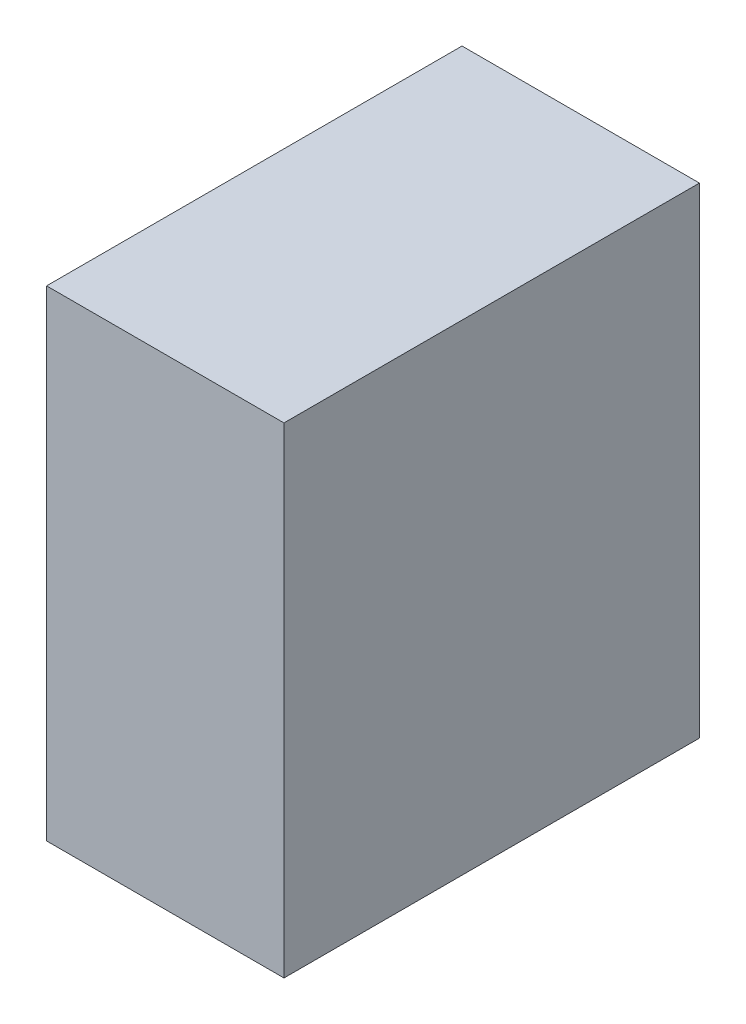
ISO-10303-21;
HEADER;
FILE_DESCRIPTION(('STEP AP214'),'2;1');
FILE_NAME('part.step','',(''),(''),'','','');
FILE_SCHEMA(('AUTOMOTIVE_DESIGN { 1 0 10303 214 1 1 1 1 }'));
ENDSEC;
DATA;
#1=APPLICATION_CONTEXT('core data for automotive mechanical design processes');
#2=APPLICATION_PROTOCOL_DEFINITION('international standard','automotive_design',2000,#1);
#3=PRODUCT_CONTEXT('',#1,'mechanical');
#4=PRODUCT('Part','Part','',(#3));
#5=PRODUCT_RELATED_PRODUCT_CATEGORY('part','',(#4));
#6=PRODUCT_DEFINITION_FORMATION('','',#4);
#7=PRODUCT_DEFINITION_CONTEXT('part definition',#1,'design');
#8=PRODUCT_DEFINITION('design','',#6,#7);
#9=PRODUCT_DEFINITION_SHAPE('','',#8);
#10=(LENGTH_UNIT() NAMED_UNIT(*) SI_UNIT(.MILLI.,.METRE.));
#11=(NAMED_UNIT(*) PLANE_ANGLE_UNIT() SI_UNIT($,.RADIAN.));
#12=(NAMED_UNIT(*) SI_UNIT($,.STERADIAN.) SOLID_ANGLE_UNIT());
#13=UNCERTAINTY_MEASURE_WITH_UNIT(LENGTH_MEASURE(1.E-05),#10,'distance_accuracy_value','');
#14=(GEOMETRIC_REPRESENTATION_CONTEXT(3) GLOBAL_UNCERTAINTY_ASSIGNED_CONTEXT((#13)) GLOBAL_UNIT_ASSIGNED_CONTEXT((#10,
#11,#12)) REPRESENTATION_CONTEXT('',''));
#15=CARTESIAN_POINT('',(0.,0.,0.));
#16=DIRECTION('',(0.,0.,1.));
#17=DIRECTION('',(1.,0.,0.));
#18=AXIS2_PLACEMENT_3D('',#15,#16,#17);
#19=CARTESIAN_POINT('',(0.,41.148,0.));
#20=DIRECTION('',(1.,0.,0.));
#21=DIRECTION('',(0.,0.,-1.));
#22=AXIS2_PLACEMENT_3D('',#19,#20,#21);
#23=PLANE('',#22);
#24=DIRECTION('',(0.,0.,1.));
#25=VECTOR('',#24,1.);
#26=CARTESIAN_POINT('',(0.,0.,0.));
#27=LINE('',#26,#25);
#28=CARTESIAN_POINT('',(0.,0.,-35.56));
#29=VERTEX_POINT('',#28);
#30=CARTESIAN_POINT('',(0.,0.,0.));
#31=VERTEX_POINT('',#30);
#32=EDGE_CURVE('E113',#29,#31,#27,.T.);
#33=ORIENTED_EDGE('',*,*,#32,.T.);
#34=DIRECTION('',(0.,-1.,0.));
#35=VECTOR('',#34,1.);
#36=CARTESIAN_POINT('',(0.,41.148,0.));
#37=LINE('',#36,#35);
#38=CARTESIAN_POINT('',(0.,41.148,0.));
#39=VERTEX_POINT('',#38);
#40=EDGE_CURVE('E11',#39,#31,#37,.T.);
#41=ORIENTED_EDGE('',*,*,#40,.F.);
#42=DIRECTION('',(0.,0.,1.));
#43=VECTOR('',#42,1.);
#44=CARTESIAN_POINT('',(0.,41.148,0.));
#45=LINE('',#44,#43);
#46=CARTESIAN_POINT('',(0.,41.148,-35.56));
#47=VERTEX_POINT('',#46);
#48=EDGE_CURVE('E97',#47,#39,#45,.T.);
#49=ORIENTED_EDGE('',*,*,#48,.F.);
#50=DIRECTION('',(0.,-1.,0.));
#51=VECTOR('',#50,1.);
#52=CARTESIAN_POINT('',(0.,41.148,-35.56));
#53=LINE('',#52,#51);
#54=EDGE_CURVE('E109',#47,#29,#53,.T.);
#55=ORIENTED_EDGE('',*,*,#54,.T.);
#56=EDGE_LOOP('',(#33,#41,#49,#55));
#57=FACE_BOUND('',#56,.T.);
#58=ADVANCED_FACE('F45',(#57),#23,.F.);
#59=CARTESIAN_POINT('',(0.,41.148,0.));
#60=DIRECTION('',(0.,0.,-1.));
#61=DIRECTION('',(-1.,0.,0.));
#62=AXIS2_PLACEMENT_3D('',#59,#60,#61);
#63=PLANE('',#62);
#64=DIRECTION('',(1.,0.,0.));
#65=VECTOR('',#64,1.);
#66=CARTESIAN_POINT('',(0.,0.,0.));
#67=LINE('',#66,#65);
#68=CARTESIAN_POINT('',(20.32,0.,0.));
#69=VERTEX_POINT('',#68);
#70=EDGE_CURVE('E102',#31,#69,#67,.T.);
#71=ORIENTED_EDGE('',*,*,#70,.T.);
#72=DIRECTION('',(0.,-1.,0.));
#73=VECTOR('',#72,1.);
#74=CARTESIAN_POINT('',(20.32,41.148,0.));
#75=LINE('',#74,#73);
#76=CARTESIAN_POINT('',(20.32,41.148,0.));
#77=VERTEX_POINT('',#76);
#78=EDGE_CURVE('E54',#77,#69,#75,.T.);
#79=ORIENTED_EDGE('',*,*,#78,.F.);
#80=DIRECTION('',(1.,0.,0.));
#81=VECTOR('',#80,1.);
#82=CARTESIAN_POINT('',(0.,41.148,0.));
#83=LINE('',#82,#81);
#84=EDGE_CURVE('E92',#39,#77,#83,.T.);
#85=ORIENTED_EDGE('',*,*,#84,.F.);
#86=ORIENTED_EDGE('',*,*,#40,.T.);
#87=EDGE_LOOP('',(#71,#79,#85,#86));
#88=FACE_BOUND('',#87,.T.);
#89=ADVANCED_FACE('F101',(#88),#63,.F.);
#90=CARTESIAN_POINT('',(20.32,41.148,0.));
#91=DIRECTION('',(-1.,0.,0.));
#92=DIRECTION('',(0.,0.,1.));
#93=AXIS2_PLACEMENT_3D('',#90,#91,#92);
#94=PLANE('',#93);
#95=DIRECTION('',(0.,0.,-1.));
#96=VECTOR('',#95,1.);
#97=CARTESIAN_POINT('',(20.32,0.,0.));
#98=LINE('',#97,#96);
#99=CARTESIAN_POINT('',(20.32,0.,-35.56));
#100=VERTEX_POINT('',#99);
#101=EDGE_CURVE('E79',#69,#100,#98,.T.);
#102=ORIENTED_EDGE('',*,*,#101,.T.);
#103=DIRECTION('',(0.,-1.,0.));
#104=VECTOR('',#103,1.);
#105=CARTESIAN_POINT('',(20.32,41.148,-35.56));
#106=LINE('',#105,#104);
#107=CARTESIAN_POINT('',(20.32,41.148,-35.56));
#108=VERTEX_POINT('',#107);
#109=EDGE_CURVE('E104',#108,#100,#106,.T.);
#110=ORIENTED_EDGE('',*,*,#109,.F.);
#111=DIRECTION('',(0.,0.,-1.));
#112=VECTOR('',#111,1.);
#113=CARTESIAN_POINT('',(20.32,41.148,0.));
#114=LINE('',#113,#112);
#115=EDGE_CURVE('E95',#77,#108,#114,.T.);
#116=ORIENTED_EDGE('',*,*,#115,.F.);
#117=ORIENTED_EDGE('',*,*,#78,.T.);
#118=EDGE_LOOP('',(#102,#110,#116,#117));
#119=FACE_BOUND('',#118,.T.);
#120=ADVANCED_FACE('F105',(#119),#94,.F.);
#121=CARTESIAN_POINT('',(0.,41.148,-35.56));
#122=DIRECTION('',(0.,0.,1.));
#123=DIRECTION('',(1.,0.,0.));
#124=AXIS2_PLACEMENT_3D('',#121,#122,#123);
#125=PLANE('',#124);
#126=DIRECTION('',(-1.,0.,0.));
#127=VECTOR('',#126,1.);
#128=CARTESIAN_POINT('',(0.,0.,-35.56));
#129=LINE('',#128,#127);
#130=EDGE_CURVE('E85',#100,#29,#129,.T.);
#131=ORIENTED_EDGE('',*,*,#130,.T.);
#132=ORIENTED_EDGE('',*,*,#54,.F.);
#133=DIRECTION('',(-1.,0.,0.));
#134=VECTOR('',#133,1.);
#135=CARTESIAN_POINT('',(0.,41.148,-35.56));
#136=LINE('',#135,#134);
#137=EDGE_CURVE('E62',#108,#47,#136,.T.);
#138=ORIENTED_EDGE('',*,*,#137,.F.);
#139=ORIENTED_EDGE('',*,*,#109,.T.);
#140=EDGE_LOOP('',(#131,#132,#138,#139));
#141=FACE_BOUND('',#140,.T.);
#142=ADVANCED_FACE('F126',(#141),#125,.F.);
#143=CARTESIAN_POINT('',(0.,41.148,0.));
#144=DIRECTION('',(0.,-1.,0.));
#145=DIRECTION('',(0.,0.,-1.));
#146=AXIS2_PLACEMENT_3D('',#143,#144,#145);
#147=PLANE('',#146);
#148=ORIENTED_EDGE('',*,*,#48,.T.);
#149=ORIENTED_EDGE('',*,*,#84,.T.);
#150=ORIENTED_EDGE('',*,*,#115,.T.);
#151=ORIENTED_EDGE('',*,*,#137,.T.);
#152=EDGE_LOOP('',(#148,#149,#150,#151));
#153=FACE_BOUND('',#152,.T.);
#154=ADVANCED_FACE('F93',(#153),#147,.F.);
#155=CARTESIAN_POINT('',(0.,0.,0.));
#156=DIRECTION('',(0.,-1.,0.));
#157=DIRECTION('',(0.,0.,-1.));
#158=AXIS2_PLACEMENT_3D('',#155,#156,#157);
#159=PLANE('',#158);
#160=ORIENTED_EDGE('',*,*,#32,.F.);
#161=ORIENTED_EDGE('',*,*,#130,.F.);
#162=ORIENTED_EDGE('',*,*,#101,.F.);
#163=ORIENTED_EDGE('',*,*,#70,.F.);
#164=EDGE_LOOP('',(#160,#161,#162,#163));
#165=FACE_BOUND('',#164,.T.);
#166=ADVANCED_FACE('F129',(#165),#159,.T.);
#167=CLOSED_SHELL('',(#58,#89,#120,#142,#154,#166));
#168=MANIFOLD_SOLID_BREP('B2',#167);
#169=ADVANCED_BREP_SHAPE_REPRESENTATION('',(#18,#168),#14);
#170=SHAPE_DEFINITION_REPRESENTATION(#9,#169);
ENDSEC;
END-ISO-10303-21;
